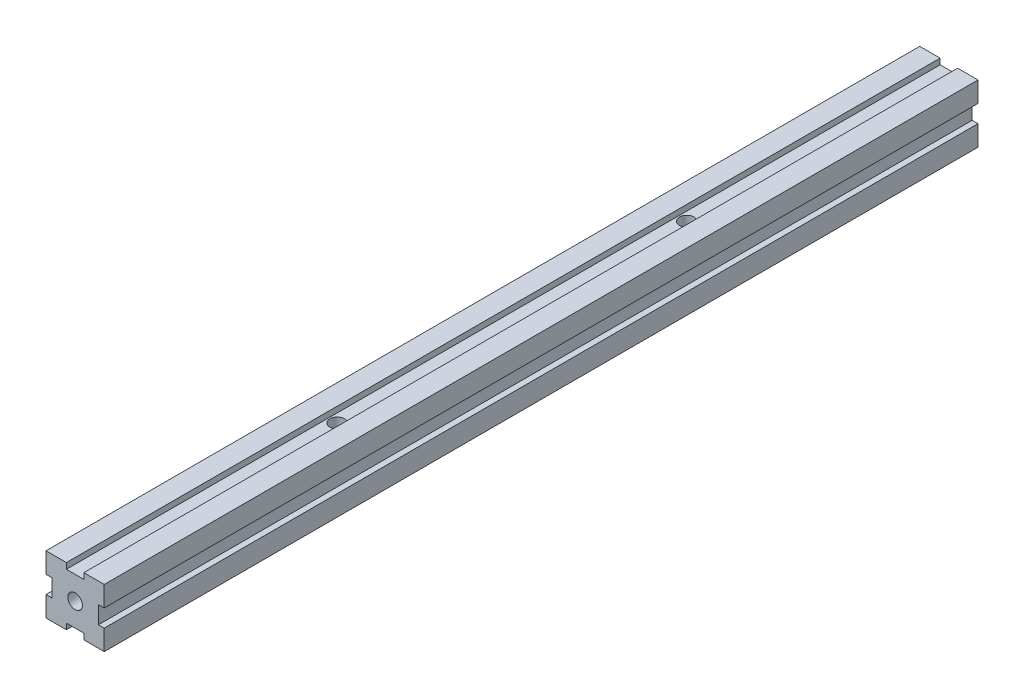
ISO-10303-21;
HEADER;
FILE_DESCRIPTION(('STEP AP214'),'2;1');
FILE_NAME('part.step','',(''),(''),'','','');
FILE_SCHEMA(('AUTOMOTIVE_DESIGN { 1 0 10303 214 1 1 1 1 }'));
ENDSEC;
DATA;
#1=APPLICATION_CONTEXT('core data for automotive mechanical design processes');
#2=APPLICATION_PROTOCOL_DEFINITION('international standard','automotive_design',2000,#1);
#3=PRODUCT_CONTEXT('',#1,'mechanical');
#4=PRODUCT('Part','Part','',(#3));
#5=PRODUCT_RELATED_PRODUCT_CATEGORY('part','',(#4));
#6=PRODUCT_DEFINITION_FORMATION('','',#4);
#7=PRODUCT_DEFINITION_CONTEXT('part definition',#1,'design');
#8=PRODUCT_DEFINITION('design','',#6,#7);
#9=PRODUCT_DEFINITION_SHAPE('','',#8);
#10=(LENGTH_UNIT() NAMED_UNIT(*) SI_UNIT(.MILLI.,.METRE.));
#11=(NAMED_UNIT(*) PLANE_ANGLE_UNIT() SI_UNIT($,.RADIAN.));
#12=(NAMED_UNIT(*) SI_UNIT($,.STERADIAN.) SOLID_ANGLE_UNIT());
#13=UNCERTAINTY_MEASURE_WITH_UNIT(LENGTH_MEASURE(1.E-05),#10,'distance_accuracy_value','');
#14=(GEOMETRIC_REPRESENTATION_CONTEXT(3) GLOBAL_UNCERTAINTY_ASSIGNED_CONTEXT((#13)) GLOBAL_UNIT_ASSIGNED_CONTEXT((#10,
#11,#12)) REPRESENTATION_CONTEXT('',''));
#15=CARTESIAN_POINT('',(0.,0.,0.));
#16=DIRECTION('',(0.,0.,1.));
#17=DIRECTION('',(1.,0.,0.));
#18=AXIS2_PLACEMENT_3D('',#15,#16,#17);
#19=CARTESIAN_POINT('',(10.,-10.,300.));
#20=DIRECTION('',(0.,0.,-1.));
#21=DIRECTION('',(-1.,0.,0.));
#22=AXIS2_PLACEMENT_3D('',#19,#20,#21);
#23=CYLINDRICAL_SURFACE('',#22,2.5);
#24=CARTESIAN_POINT('',(10.,-10.,210.));
#25=DIRECTION('',(0.,0.707106781186547,-0.707106781186547));
#26=DIRECTION('',(0.,-0.707106781186547,-0.707106781186547));
#27=AXIS2_PLACEMENT_3D('',#24,#25,#26);
#28=ELLIPSE('',#27,3.53553390593274,2.5);
#29=CARTESIAN_POINT('',(12.5,-10.,210.));
#30=VERTEX_POINT('',#29);
#31=CARTESIAN_POINT('',(7.5,-10.,210.));
#32=VERTEX_POINT('',#31);
#33=EDGE_CURVE('E189',#30,#32,#28,.F.);
#34=ORIENTED_EDGE('',*,*,#33,.F.);
#35=CARTESIAN_POINT('',(10.,-10.,210.));
#36=DIRECTION('',(0.,-0.707106781186547,-0.707106781186547));
#37=DIRECTION('',(0.,0.707106781186547,-0.707106781186547));
#38=AXIS2_PLACEMENT_3D('',#35,#36,#37);
#39=ELLIPSE('',#38,3.53553390593274,2.5);
#40=EDGE_CURVE('E56',#32,#30,#39,.F.);
#41=ORIENTED_EDGE('',*,*,#40,.F.);
#42=EDGE_LOOP('',(#34,#41));
#43=FACE_BOUND('',#42,.T.);
#44=CARTESIAN_POINT('',(10.,-10.,300.));
#45=DIRECTION('',(0.,0.,1.));
#46=DIRECTION('',(1.,0.,0.));
#47=AXIS2_PLACEMENT_3D('',#44,#45,#46);
#48=CIRCLE('',#47,2.5);
#49=CARTESIAN_POINT('',(12.5,-10.,300.));
#50=VERTEX_POINT('',#49);
#51=EDGE_CURVE('E224',#50,#50,#48,.T.);
#52=ORIENTED_EDGE('',*,*,#51,.T.);
#53=EDGE_LOOP('',(#52));
#54=FACE_BOUND('',#53,.T.);
#55=ADVANCED_FACE('F35',(#43,#54),#23,.F.);
#56=CARTESIAN_POINT('',(0.,0.,300.));
#57=DIRECTION('',(0.,0.,1.));
#58=DIRECTION('',(1.,0.,0.));
#59=AXIS2_PLACEMENT_3D('',#56,#57,#58);
#60=PLANE('',#59);
#61=DIRECTION('',(0.,-1.,0.));
#62=VECTOR('',#61,1.);
#63=CARTESIAN_POINT('',(0.,0.,300.));
#64=LINE('',#63,#62);
#65=CARTESIAN_POINT('',(0.,0.,300.));
#66=VERTEX_POINT('',#65);
#67=CARTESIAN_POINT('',(0.,-7.,300.));
#68=VERTEX_POINT('',#67);
#69=EDGE_CURVE('E234',#66,#68,#64,.T.);
#70=ORIENTED_EDGE('',*,*,#69,.T.);
#71=DIRECTION('',(1.,0.,0.));
#72=VECTOR('',#71,1.);
#73=CARTESIAN_POINT('',(0.,-7.,300.));
#74=LINE('',#73,#72);
#75=CARTESIAN_POINT('',(2.,-7.,300.));
#76=VERTEX_POINT('',#75);
#77=EDGE_CURVE('E237',#68,#76,#74,.T.);
#78=ORIENTED_EDGE('',*,*,#77,.T.);
#79=DIRECTION('',(0.,-1.,0.));
#80=VECTOR('',#79,1.);
#81=CARTESIAN_POINT('',(2.,-7.,300.));
#82=LINE('',#81,#80);
#83=CARTESIAN_POINT('',(2.,-13.,300.));
#84=VERTEX_POINT('',#83);
#85=EDGE_CURVE('E240',#76,#84,#82,.T.);
#86=ORIENTED_EDGE('',*,*,#85,.T.);
#87=DIRECTION('',(-1.,0.,0.));
#88=VECTOR('',#87,1.);
#89=CARTESIAN_POINT('',(0.,-13.,300.));
#90=LINE('',#89,#88);
#91=CARTESIAN_POINT('',(0.,-13.,300.));
#92=VERTEX_POINT('',#91);
#93=EDGE_CURVE('E242',#84,#92,#90,.T.);
#94=ORIENTED_EDGE('',*,*,#93,.T.);
#95=DIRECTION('',(0.,-1.,0.));
#96=VECTOR('',#95,1.);
#97=CARTESIAN_POINT('',(0.,-13.,300.));
#98=LINE('',#97,#96);
#99=CARTESIAN_POINT('',(0.,-20.,300.));
#100=VERTEX_POINT('',#99);
#101=EDGE_CURVE('E244',#92,#100,#98,.T.);
#102=ORIENTED_EDGE('',*,*,#101,.T.);
#103=DIRECTION('',(1.,0.,0.));
#104=VECTOR('',#103,1.);
#105=CARTESIAN_POINT('',(0.,-20.,300.));
#106=LINE('',#105,#104);
#107=CARTESIAN_POINT('',(7.,-20.,300.));
#108=VERTEX_POINT('',#107);
#109=EDGE_CURVE('E246',#100,#108,#106,.T.);
#110=ORIENTED_EDGE('',*,*,#109,.T.);
#111=DIRECTION('',(0.,1.,0.));
#112=VECTOR('',#111,1.);
#113=CARTESIAN_POINT('',(7.,-20.,300.));
#114=LINE('',#113,#112);
#115=CARTESIAN_POINT('',(7.,-18.,300.));
#116=VERTEX_POINT('',#115);
#117=EDGE_CURVE('E248',#108,#116,#114,.T.);
#118=ORIENTED_EDGE('',*,*,#117,.T.);
#119=DIRECTION('',(1.,0.,0.));
#120=VECTOR('',#119,1.);
#121=CARTESIAN_POINT('',(7.,-18.,300.));
#122=LINE('',#121,#120);
#123=CARTESIAN_POINT('',(13.,-18.,300.));
#124=VERTEX_POINT('',#123);
#125=EDGE_CURVE('E250',#116,#124,#122,.T.);
#126=ORIENTED_EDGE('',*,*,#125,.T.);
#127=DIRECTION('',(0.,-1.,0.));
#128=VECTOR('',#127,1.);
#129=CARTESIAN_POINT('',(13.,-20.,300.));
#130=LINE('',#129,#128);
#131=CARTESIAN_POINT('',(13.,-20.,300.));
#132=VERTEX_POINT('',#131);
#133=EDGE_CURVE('E252',#124,#132,#130,.T.);
#134=ORIENTED_EDGE('',*,*,#133,.T.);
#135=DIRECTION('',(1.,0.,0.));
#136=VECTOR('',#135,1.);
#137=CARTESIAN_POINT('',(13.,-20.,300.));
#138=LINE('',#137,#136);
#139=CARTESIAN_POINT('',(20.,-20.,300.));
#140=VERTEX_POINT('',#139);
#141=EDGE_CURVE('E254',#132,#140,#138,.T.);
#142=ORIENTED_EDGE('',*,*,#141,.T.);
#143=DIRECTION('',(0.,1.,0.));
#144=VECTOR('',#143,1.);
#145=CARTESIAN_POINT('',(20.,-13.,300.));
#146=LINE('',#145,#144);
#147=CARTESIAN_POINT('',(20.,-13.,300.));
#148=VERTEX_POINT('',#147);
#149=EDGE_CURVE('E256',#140,#148,#146,.T.);
#150=ORIENTED_EDGE('',*,*,#149,.T.);
#151=DIRECTION('',(-1.,0.,0.));
#152=VECTOR('',#151,1.);
#153=CARTESIAN_POINT('',(20.,-13.,300.));
#154=LINE('',#153,#152);
#155=CARTESIAN_POINT('',(18.,-13.,300.));
#156=VERTEX_POINT('',#155);
#157=EDGE_CURVE('E258',#148,#156,#154,.T.);
#158=ORIENTED_EDGE('',*,*,#157,.T.);
#159=DIRECTION('',(0.,1.,0.));
#160=VECTOR('',#159,1.);
#161=CARTESIAN_POINT('',(18.,-7.,300.));
#162=LINE('',#161,#160);
#163=CARTESIAN_POINT('',(18.,-7.,300.));
#164=VERTEX_POINT('',#163);
#165=EDGE_CURVE('E260',#156,#164,#162,.T.);
#166=ORIENTED_EDGE('',*,*,#165,.T.);
#167=DIRECTION('',(1.,0.,0.));
#168=VECTOR('',#167,1.);
#169=CARTESIAN_POINT('',(20.,-7.,300.));
#170=LINE('',#169,#168);
#171=CARTESIAN_POINT('',(20.,-7.,300.));
#172=VERTEX_POINT('',#171);
#173=EDGE_CURVE('E262',#164,#172,#170,.T.);
#174=ORIENTED_EDGE('',*,*,#173,.T.);
#175=DIRECTION('',(0.,1.,0.));
#176=VECTOR('',#175,1.);
#177=CARTESIAN_POINT('',(20.,0.,300.));
#178=LINE('',#177,#176);
#179=CARTESIAN_POINT('',(20.,0.,300.));
#180=VERTEX_POINT('',#179);
#181=EDGE_CURVE('E264',#172,#180,#178,.T.);
#182=ORIENTED_EDGE('',*,*,#181,.T.);
#183=DIRECTION('',(-1.,0.,0.));
#184=VECTOR('',#183,1.);
#185=CARTESIAN_POINT('',(13.,0.,300.));
#186=LINE('',#185,#184);
#187=CARTESIAN_POINT('',(13.,0.,300.));
#188=VERTEX_POINT('',#187);
#189=EDGE_CURVE('E266',#180,#188,#186,.T.);
#190=ORIENTED_EDGE('',*,*,#189,.T.);
#191=DIRECTION('',(0.,-1.,0.));
#192=VECTOR('',#191,1.);
#193=CARTESIAN_POINT('',(13.,0.,300.));
#194=LINE('',#193,#192);
#195=CARTESIAN_POINT('',(13.,-2.,300.));
#196=VERTEX_POINT('',#195);
#197=EDGE_CURVE('E268',#188,#196,#194,.T.);
#198=ORIENTED_EDGE('',*,*,#197,.T.);
#199=DIRECTION('',(-1.,0.,0.));
#200=VECTOR('',#199,1.);
#201=CARTESIAN_POINT('',(7.,-2.,300.));
#202=LINE('',#201,#200);
#203=CARTESIAN_POINT('',(7.,-2.,300.));
#204=VERTEX_POINT('',#203);
#205=EDGE_CURVE('E270',#196,#204,#202,.T.);
#206=ORIENTED_EDGE('',*,*,#205,.T.);
#207=DIRECTION('',(0.,1.,0.));
#208=VECTOR('',#207,1.);
#209=CARTESIAN_POINT('',(7.,0.,300.));
#210=LINE('',#209,#208);
#211=CARTESIAN_POINT('',(7.,0.,300.));
#212=VERTEX_POINT('',#211);
#213=EDGE_CURVE('E272',#204,#212,#210,.T.);
#214=ORIENTED_EDGE('',*,*,#213,.T.);
#215=DIRECTION('',(-1.,0.,0.));
#216=VECTOR('',#215,1.);
#217=CARTESIAN_POINT('',(0.,0.,300.));
#218=LINE('',#217,#216);
#219=EDGE_CURVE('E274',#212,#66,#218,.T.);
#220=ORIENTED_EDGE('',*,*,#219,.T.);
#221=EDGE_LOOP('',(#70,#78,#86,#94,#102,#110,#118,#126,#134,#142,#150,#158,#166,#174,#182,#190,
#198,#206,#214,#220));
#222=FACE_BOUND('',#221,.T.);
#223=ORIENTED_EDGE('',*,*,#51,.F.);
#224=EDGE_LOOP('',(#223));
#225=FACE_BOUND('',#224,.T.);
#226=ADVANCED_FACE('F398',(#222,#225),#60,.T.);
#227=CARTESIAN_POINT('',(0.,0.,0.));
#228=DIRECTION('',(0.,0.,1.));
#229=DIRECTION('',(1.,0.,0.));
#230=AXIS2_PLACEMENT_3D('',#227,#228,#229);
#231=PLANE('',#230);
#232=DIRECTION('',(0.,-1.,0.));
#233=VECTOR('',#232,1.);
#234=CARTESIAN_POINT('',(0.,0.,0.));
#235=LINE('',#234,#233);
#236=CARTESIAN_POINT('',(0.,0.,0.));
#237=VERTEX_POINT('',#236);
#238=CARTESIAN_POINT('',(0.,-7.,0.));
#239=VERTEX_POINT('',#238);
#240=EDGE_CURVE('E228',#237,#239,#235,.T.);
#241=ORIENTED_EDGE('',*,*,#240,.F.);
#242=DIRECTION('',(-1.,0.,0.));
#243=VECTOR('',#242,1.);
#244=CARTESIAN_POINT('',(0.,0.,0.));
#245=LINE('',#244,#243);
#246=CARTESIAN_POINT('',(7.,0.,0.));
#247=VERTEX_POINT('',#246);
#248=EDGE_CURVE('E238',#247,#237,#245,.T.);
#249=ORIENTED_EDGE('',*,*,#248,.F.);
#250=DIRECTION('',(0.,1.,0.));
#251=VECTOR('',#250,1.);
#252=CARTESIAN_POINT('',(7.,0.,0.));
#253=LINE('',#252,#251);
#254=CARTESIAN_POINT('',(7.,-2.,0.));
#255=VERTEX_POINT('',#254);
#256=EDGE_CURVE('E313',#255,#247,#253,.T.);
#257=ORIENTED_EDGE('',*,*,#256,.F.);
#258=DIRECTION('',(-1.,0.,0.));
#259=VECTOR('',#258,1.);
#260=CARTESIAN_POINT('',(7.,-2.,0.));
#261=LINE('',#260,#259);
#262=CARTESIAN_POINT('',(13.,-2.,0.));
#263=VERTEX_POINT('',#262);
#264=EDGE_CURVE('E311',#263,#255,#261,.T.);
#265=ORIENTED_EDGE('',*,*,#264,.F.);
#266=DIRECTION('',(0.,-1.,0.));
#267=VECTOR('',#266,1.);
#268=CARTESIAN_POINT('',(13.,0.,0.));
#269=LINE('',#268,#267);
#270=CARTESIAN_POINT('',(13.,0.,0.));
#271=VERTEX_POINT('',#270);
#272=EDGE_CURVE('E309',#271,#263,#269,.T.);
#273=ORIENTED_EDGE('',*,*,#272,.F.);
#274=DIRECTION('',(-1.,0.,0.));
#275=VECTOR('',#274,1.);
#276=CARTESIAN_POINT('',(13.,0.,0.));
#277=LINE('',#276,#275);
#278=CARTESIAN_POINT('',(20.,0.,0.));
#279=VERTEX_POINT('',#278);
#280=EDGE_CURVE('E307',#279,#271,#277,.T.);
#281=ORIENTED_EDGE('',*,*,#280,.F.);
#282=DIRECTION('',(0.,1.,0.));
#283=VECTOR('',#282,1.);
#284=CARTESIAN_POINT('',(20.,0.,0.));
#285=LINE('',#284,#283);
#286=CARTESIAN_POINT('',(20.,-7.,0.));
#287=VERTEX_POINT('',#286);
#288=EDGE_CURVE('E305',#287,#279,#285,.T.);
#289=ORIENTED_EDGE('',*,*,#288,.F.);
#290=DIRECTION('',(1.,0.,0.));
#291=VECTOR('',#290,1.);
#292=CARTESIAN_POINT('',(20.,-7.,0.));
#293=LINE('',#292,#291);
#294=CARTESIAN_POINT('',(18.,-7.,0.));
#295=VERTEX_POINT('',#294);
#296=EDGE_CURVE('E303',#295,#287,#293,.T.);
#297=ORIENTED_EDGE('',*,*,#296,.F.);
#298=DIRECTION('',(0.,1.,0.));
#299=VECTOR('',#298,1.);
#300=CARTESIAN_POINT('',(18.,-7.,0.));
#301=LINE('',#300,#299);
#302=CARTESIAN_POINT('',(18.,-13.,0.));
#303=VERTEX_POINT('',#302);
#304=EDGE_CURVE('E301',#303,#295,#301,.T.);
#305=ORIENTED_EDGE('',*,*,#304,.F.);
#306=DIRECTION('',(-1.,0.,0.));
#307=VECTOR('',#306,1.);
#308=CARTESIAN_POINT('',(20.,-13.,0.));
#309=LINE('',#308,#307);
#310=CARTESIAN_POINT('',(20.,-13.,0.));
#311=VERTEX_POINT('',#310);
#312=EDGE_CURVE('E299',#311,#303,#309,.T.);
#313=ORIENTED_EDGE('',*,*,#312,.F.);
#314=DIRECTION('',(0.,1.,0.));
#315=VECTOR('',#314,1.);
#316=CARTESIAN_POINT('',(20.,-13.,0.));
#317=LINE('',#316,#315);
#318=CARTESIAN_POINT('',(20.,-20.,0.));
#319=VERTEX_POINT('',#318);
#320=EDGE_CURVE('E297',#319,#311,#317,.T.);
#321=ORIENTED_EDGE('',*,*,#320,.F.);
#322=DIRECTION('',(1.,0.,0.));
#323=VECTOR('',#322,1.);
#324=CARTESIAN_POINT('',(13.,-20.,0.));
#325=LINE('',#324,#323);
#326=CARTESIAN_POINT('',(13.,-20.,0.));
#327=VERTEX_POINT('',#326);
#328=EDGE_CURVE('E295',#327,#319,#325,.T.);
#329=ORIENTED_EDGE('',*,*,#328,.F.);
#330=DIRECTION('',(0.,-1.,0.));
#331=VECTOR('',#330,1.);
#332=CARTESIAN_POINT('',(13.,-20.,0.));
#333=LINE('',#332,#331);
#334=CARTESIAN_POINT('',(13.,-18.,0.));
#335=VERTEX_POINT('',#334);
#336=EDGE_CURVE('E293',#335,#327,#333,.T.);
#337=ORIENTED_EDGE('',*,*,#336,.F.);
#338=DIRECTION('',(1.,0.,0.));
#339=VECTOR('',#338,1.);
#340=CARTESIAN_POINT('',(7.,-18.,0.));
#341=LINE('',#340,#339);
#342=CARTESIAN_POINT('',(7.,-18.,0.));
#343=VERTEX_POINT('',#342);
#344=EDGE_CURVE('E291',#343,#335,#341,.T.);
#345=ORIENTED_EDGE('',*,*,#344,.F.);
#346=DIRECTION('',(0.,1.,0.));
#347=VECTOR('',#346,1.);
#348=CARTESIAN_POINT('',(7.,-20.,0.));
#349=LINE('',#348,#347);
#350=CARTESIAN_POINT('',(7.,-20.,0.));
#351=VERTEX_POINT('',#350);
#352=EDGE_CURVE('E289',#351,#343,#349,.T.);
#353=ORIENTED_EDGE('',*,*,#352,.F.);
#354=DIRECTION('',(1.,0.,0.));
#355=VECTOR('',#354,1.);
#356=CARTESIAN_POINT('',(0.,-20.,0.));
#357=LINE('',#356,#355);
#358=CARTESIAN_POINT('',(0.,-20.,0.));
#359=VERTEX_POINT('',#358);
#360=EDGE_CURVE('E287',#359,#351,#357,.T.);
#361=ORIENTED_EDGE('',*,*,#360,.F.);
#362=DIRECTION('',(0.,-1.,0.));
#363=VECTOR('',#362,1.);
#364=CARTESIAN_POINT('',(0.,-13.,0.));
#365=LINE('',#364,#363);
#366=CARTESIAN_POINT('',(0.,-13.,0.));
#367=VERTEX_POINT('',#366);
#368=EDGE_CURVE('E285',#367,#359,#365,.T.);
#369=ORIENTED_EDGE('',*,*,#368,.F.);
#370=DIRECTION('',(-1.,0.,0.));
#371=VECTOR('',#370,1.);
#372=CARTESIAN_POINT('',(0.,-13.,0.));
#373=LINE('',#372,#371);
#374=CARTESIAN_POINT('',(2.,-13.,0.));
#375=VERTEX_POINT('',#374);
#376=EDGE_CURVE('E283',#375,#367,#373,.T.);
#377=ORIENTED_EDGE('',*,*,#376,.F.);
#378=DIRECTION('',(0.,-1.,0.));
#379=VECTOR('',#378,1.);
#380=CARTESIAN_POINT('',(2.,-7.,0.));
#381=LINE('',#380,#379);
#382=CARTESIAN_POINT('',(2.,-7.,0.));
#383=VERTEX_POINT('',#382);
#384=EDGE_CURVE('E281',#383,#375,#381,.T.);
#385=ORIENTED_EDGE('',*,*,#384,.F.);
#386=DIRECTION('',(1.,0.,0.));
#387=VECTOR('',#386,1.);
#388=CARTESIAN_POINT('',(0.,-7.,0.));
#389=LINE('',#388,#387);
#390=EDGE_CURVE('E279',#239,#383,#389,.T.);
#391=ORIENTED_EDGE('',*,*,#390,.F.);
#392=EDGE_LOOP('',(#241,#249,#257,#265,#273,#281,#289,#297,#305,#313,#321,#329,#337,#345,#353,
#361,#369,#377,#385,#391));
#393=FACE_BOUND('',#392,.T.);
#394=CARTESIAN_POINT('',(10.,-10.,0.));
#395=DIRECTION('',(0.,0.,1.));
#396=DIRECTION('',(1.,0.,0.));
#397=AXIS2_PLACEMENT_3D('',#394,#395,#396);
#398=CIRCLE('',#397,2.5);
#399=CARTESIAN_POINT('',(12.5,-10.,0.));
#400=VERTEX_POINT('',#399);
#401=EDGE_CURVE('E222',#400,#400,#398,.T.);
#402=ORIENTED_EDGE('',*,*,#401,.T.);
#403=EDGE_LOOP('',(#402));
#404=FACE_BOUND('',#403,.T.);
#405=ADVANCED_FACE('F383',(#393,#404),#231,.F.);
#406=CARTESIAN_POINT('',(0.,0.,300.));
#407=DIRECTION('',(1.,0.,0.));
#408=DIRECTION('',(0.,1.,0.));
#409=AXIS2_PLACEMENT_3D('',#406,#407,#408);
#410=PLANE('',#409);
#411=ORIENTED_EDGE('',*,*,#240,.T.);
#412=DIRECTION('',(0.,0.,-1.));
#413=VECTOR('',#412,1.);
#414=CARTESIAN_POINT('',(0.,-7.,300.));
#415=LINE('',#414,#413);
#416=EDGE_CURVE('E197',#68,#239,#415,.T.);
#417=ORIENTED_EDGE('',*,*,#416,.F.);
#418=ORIENTED_EDGE('',*,*,#69,.F.);
#419=DIRECTION('',(0.,0.,-1.));
#420=VECTOR('',#419,1.);
#421=CARTESIAN_POINT('',(0.,0.,300.));
#422=LINE('',#421,#420);
#423=EDGE_CURVE('E276',#66,#237,#422,.T.);
#424=ORIENTED_EDGE('',*,*,#423,.T.);
#425=EDGE_LOOP('',(#411,#417,#418,#424));
#426=FACE_BOUND('',#425,.T.);
#427=ADVANCED_FACE('F37',(#426),#410,.F.);
#428=CARTESIAN_POINT('',(0.,-7.,300.));
#429=DIRECTION('',(0.,1.,0.));
#430=DIRECTION('',(-1.,0.,0.));
#431=AXIS2_PLACEMENT_3D('',#428,#429,#430);
#432=PLANE('',#431);
#433=ORIENTED_EDGE('',*,*,#390,.T.);
#434=DIRECTION('',(0.,0.,-1.));
#435=VECTOR('',#434,1.);
#436=CARTESIAN_POINT('',(2.,-7.,300.));
#437=LINE('',#436,#435);
#438=EDGE_CURVE('E369',#76,#383,#437,.T.);
#439=ORIENTED_EDGE('',*,*,#438,.F.);
#440=ORIENTED_EDGE('',*,*,#77,.F.);
#441=ORIENTED_EDGE('',*,*,#416,.T.);
#442=EDGE_LOOP('',(#433,#439,#440,#441));
#443=FACE_BOUND('',#442,.T.);
#444=ADVANCED_FACE('F375',(#443),#432,.F.);
#445=CARTESIAN_POINT('',(2.,-7.,300.));
#446=DIRECTION('',(1.,0.,0.));
#447=DIRECTION('',(0.,0.,-1.));
#448=AXIS2_PLACEMENT_3D('',#445,#446,#447);
#449=PLANE('',#448);
#450=ORIENTED_EDGE('',*,*,#384,.T.);
#451=DIRECTION('',(0.,0.,-1.));
#452=VECTOR('',#451,1.);
#453=CARTESIAN_POINT('',(2.,-13.,300.));
#454=LINE('',#453,#452);
#455=EDGE_CURVE('E366',#84,#375,#454,.T.);
#456=ORIENTED_EDGE('',*,*,#455,.F.);
#457=ORIENTED_EDGE('',*,*,#85,.F.);
#458=ORIENTED_EDGE('',*,*,#438,.T.);
#459=EDGE_LOOP('',(#450,#456,#457,#458));
#460=FACE_BOUND('',#459,.T.);
#461=ADVANCED_FACE('F390',(#460),#449,.F.);
#462=CARTESIAN_POINT('',(0.,-13.,300.));
#463=DIRECTION('',(0.,-1.,0.));
#464=DIRECTION('',(1.,0.,0.));
#465=AXIS2_PLACEMENT_3D('',#462,#463,#464);
#466=PLANE('',#465);
#467=ORIENTED_EDGE('',*,*,#376,.T.);
#468=DIRECTION('',(0.,0.,-1.));
#469=VECTOR('',#468,1.);
#470=CARTESIAN_POINT('',(0.,-13.,300.));
#471=LINE('',#470,#469);
#472=EDGE_CURVE('E363',#92,#367,#471,.T.);
#473=ORIENTED_EDGE('',*,*,#472,.F.);
#474=ORIENTED_EDGE('',*,*,#93,.F.);
#475=ORIENTED_EDGE('',*,*,#455,.T.);
#476=EDGE_LOOP('',(#467,#473,#474,#475));
#477=FACE_BOUND('',#476,.T.);
#478=ADVANCED_FACE('F394',(#477),#466,.F.);
#479=CARTESIAN_POINT('',(0.,-13.,300.));
#480=DIRECTION('',(1.,0.,0.));
#481=DIRECTION('',(0.,1.,0.));
#482=AXIS2_PLACEMENT_3D('',#479,#480,#481);
#483=PLANE('',#482);
#484=ORIENTED_EDGE('',*,*,#368,.T.);
#485=DIRECTION('',(0.,0.,-1.));
#486=VECTOR('',#485,1.);
#487=CARTESIAN_POINT('',(0.,-20.,300.));
#488=LINE('',#487,#486);
#489=EDGE_CURVE('E360',#100,#359,#488,.T.);
#490=ORIENTED_EDGE('',*,*,#489,.F.);
#491=ORIENTED_EDGE('',*,*,#101,.F.);
#492=ORIENTED_EDGE('',*,*,#472,.T.);
#493=EDGE_LOOP('',(#484,#490,#491,#492));
#494=FACE_BOUND('',#493,.T.);
#495=ADVANCED_FACE('F473',(#494),#483,.F.);
#496=CARTESIAN_POINT('',(0.,-20.,300.));
#497=DIRECTION('',(0.,1.,0.));
#498=DIRECTION('',(0.,0.,1.));
#499=AXIS2_PLACEMENT_3D('',#496,#497,#498);
#500=PLANE('',#499);
#501=ORIENTED_EDGE('',*,*,#360,.T.);
#502=DIRECTION('',(0.,0.,-1.));
#503=VECTOR('',#502,1.);
#504=CARTESIAN_POINT('',(7.,-20.,300.));
#505=LINE('',#504,#503);
#506=EDGE_CURVE('E357',#108,#351,#505,.T.);
#507=ORIENTED_EDGE('',*,*,#506,.F.);
#508=ORIENTED_EDGE('',*,*,#109,.F.);
#509=ORIENTED_EDGE('',*,*,#489,.T.);
#510=EDGE_LOOP('',(#501,#507,#508,#509));
#511=FACE_BOUND('',#510,.T.);
#512=ADVANCED_FACE('F470',(#511),#500,.F.);
#513=CARTESIAN_POINT('',(7.,-20.,300.));
#514=DIRECTION('',(-1.,0.,0.));
#515=DIRECTION('',(0.,-1.,0.));
#516=AXIS2_PLACEMENT_3D('',#513,#514,#515);
#517=PLANE('',#516);
#518=ORIENTED_EDGE('',*,*,#352,.T.);
#519=DIRECTION('',(0.,0.,-1.));
#520=VECTOR('',#519,1.);
#521=CARTESIAN_POINT('',(7.,-18.,300.));
#522=LINE('',#521,#520);
#523=EDGE_CURVE('E354',#116,#343,#522,.T.);
#524=ORIENTED_EDGE('',*,*,#523,.F.);
#525=ORIENTED_EDGE('',*,*,#117,.F.);
#526=ORIENTED_EDGE('',*,*,#506,.T.);
#527=EDGE_LOOP('',(#518,#524,#525,#526));
#528=FACE_BOUND('',#527,.T.);
#529=ADVANCED_FACE('F466',(#528),#517,.F.);
#530=CARTESIAN_POINT('',(7.,-18.,300.));
#531=DIRECTION('',(0.,1.,0.));
#532=DIRECTION('',(0.,0.,1.));
#533=AXIS2_PLACEMENT_3D('',#530,#531,#532);
#534=PLANE('',#533);
#535=CARTESIAN_POINT('',(10.,-18.,90.));
#536=DIRECTION('',(0.,1.,0.));
#537=DIRECTION('',(0.,0.,1.));
#538=AXIS2_PLACEMENT_3D('',#535,#536,#537);
#539=CIRCLE('',#538,2.5);
#540=CARTESIAN_POINT('',(10.,-18.,92.5));
#541=VERTEX_POINT('',#540);
#542=EDGE_CURVE('E225',#541,#541,#539,.T.);
#543=ORIENTED_EDGE('',*,*,#542,.T.);
#544=EDGE_LOOP('',(#543));
#545=FACE_BOUND('',#544,.T.);
#546=CARTESIAN_POINT('',(10.,-18.,210.));
#547=DIRECTION('',(0.,1.,0.));
#548=DIRECTION('',(0.,0.,1.));
#549=AXIS2_PLACEMENT_3D('',#546,#547,#548);
#550=CIRCLE('',#549,2.5);
#551=CARTESIAN_POINT('',(10.,-18.,212.5));
#552=VERTEX_POINT('',#551);
#553=EDGE_CURVE('E704',#552,#552,#550,.T.);
#554=ORIENTED_EDGE('',*,*,#553,.T.);
#555=EDGE_LOOP('',(#554));
#556=FACE_BOUND('',#555,.T.);
#557=ORIENTED_EDGE('',*,*,#344,.T.);
#558=DIRECTION('',(0.,0.,-1.));
#559=VECTOR('',#558,1.);
#560=CARTESIAN_POINT('',(13.,-18.,300.));
#561=LINE('',#560,#559);
#562=EDGE_CURVE('E351',#124,#335,#561,.T.);
#563=ORIENTED_EDGE('',*,*,#562,.F.);
#564=ORIENTED_EDGE('',*,*,#125,.F.);
#565=ORIENTED_EDGE('',*,*,#523,.T.);
#566=EDGE_LOOP('',(#557,#563,#564,#565));
#567=FACE_BOUND('',#566,.T.);
#568=ADVANCED_FACE('F462',(#545,#556,#567),#534,.F.);
#569=CARTESIAN_POINT('',(13.,-20.,300.));
#570=DIRECTION('',(1.,0.,0.));
#571=DIRECTION('',(0.,1.,0.));
#572=AXIS2_PLACEMENT_3D('',#569,#570,#571);
#573=PLANE('',#572);
#574=ORIENTED_EDGE('',*,*,#336,.T.);
#575=DIRECTION('',(0.,0.,-1.));
#576=VECTOR('',#575,1.);
#577=CARTESIAN_POINT('',(13.,-20.,300.));
#578=LINE('',#577,#576);
#579=EDGE_CURVE('E348',#132,#327,#578,.T.);
#580=ORIENTED_EDGE('',*,*,#579,.F.);
#581=ORIENTED_EDGE('',*,*,#133,.F.);
#582=ORIENTED_EDGE('',*,*,#562,.T.);
#583=EDGE_LOOP('',(#574,#580,#581,#582));
#584=FACE_BOUND('',#583,.T.);
#585=ADVANCED_FACE('F457',(#584),#573,.F.);
#586=CARTESIAN_POINT('',(13.,-20.,300.));
#587=DIRECTION('',(0.,1.,0.));
#588=DIRECTION('',(0.,0.,1.));
#589=AXIS2_PLACEMENT_3D('',#586,#587,#588);
#590=PLANE('',#589);
#591=ORIENTED_EDGE('',*,*,#328,.T.);
#592=DIRECTION('',(0.,0.,-1.));
#593=VECTOR('',#592,1.);
#594=CARTESIAN_POINT('',(20.,-20.,300.));
#595=LINE('',#594,#593);
#596=EDGE_CURVE('E345',#140,#319,#595,.T.);
#597=ORIENTED_EDGE('',*,*,#596,.F.);
#598=ORIENTED_EDGE('',*,*,#141,.F.);
#599=ORIENTED_EDGE('',*,*,#579,.T.);
#600=EDGE_LOOP('',(#591,#597,#598,#599));
#601=FACE_BOUND('',#600,.T.);
#602=ADVANCED_FACE('F451',(#601),#590,.F.);
#603=CARTESIAN_POINT('',(20.,-13.,300.));
#604=DIRECTION('',(-1.,0.,0.));
#605=DIRECTION('',(0.,0.,1.));
#606=AXIS2_PLACEMENT_3D('',#603,#604,#605);
#607=PLANE('',#606);
#608=ORIENTED_EDGE('',*,*,#320,.T.);
#609=DIRECTION('',(0.,0.,-1.));
#610=VECTOR('',#609,1.);
#611=CARTESIAN_POINT('',(20.,-13.,300.));
#612=LINE('',#611,#610);
#613=EDGE_CURVE('E342',#148,#311,#612,.T.);
#614=ORIENTED_EDGE('',*,*,#613,.F.);
#615=ORIENTED_EDGE('',*,*,#149,.F.);
#616=ORIENTED_EDGE('',*,*,#596,.T.);
#617=EDGE_LOOP('',(#608,#614,#615,#616));
#618=FACE_BOUND('',#617,.T.);
#619=ADVANCED_FACE('F447',(#618),#607,.F.);
#620=CARTESIAN_POINT('',(20.,-13.,300.));
#621=DIRECTION('',(0.,-1.,0.));
#622=DIRECTION('',(1.,0.,0.));
#623=AXIS2_PLACEMENT_3D('',#620,#621,#622);
#624=PLANE('',#623);
#625=ORIENTED_EDGE('',*,*,#312,.T.);
#626=DIRECTION('',(0.,0.,-1.));
#627=VECTOR('',#626,1.);
#628=CARTESIAN_POINT('',(18.,-13.,300.));
#629=LINE('',#628,#627);
#630=EDGE_CURVE('E339',#156,#303,#629,.T.);
#631=ORIENTED_EDGE('',*,*,#630,.F.);
#632=ORIENTED_EDGE('',*,*,#157,.F.);
#633=ORIENTED_EDGE('',*,*,#613,.T.);
#634=EDGE_LOOP('',(#625,#631,#632,#633));
#635=FACE_BOUND('',#634,.T.);
#636=ADVANCED_FACE('F442',(#635),#624,.F.);
#637=CARTESIAN_POINT('',(18.,-7.,300.));
#638=DIRECTION('',(-1.,0.,0.));
#639=DIRECTION('',(0.,0.,1.));
#640=AXIS2_PLACEMENT_3D('',#637,#638,#639);
#641=PLANE('',#640);
#642=ORIENTED_EDGE('',*,*,#304,.T.);
#643=DIRECTION('',(0.,0.,-1.));
#644=VECTOR('',#643,1.);
#645=CARTESIAN_POINT('',(18.,-7.,300.));
#646=LINE('',#645,#644);
#647=EDGE_CURVE('E336',#164,#295,#646,.T.);
#648=ORIENTED_EDGE('',*,*,#647,.F.);
#649=ORIENTED_EDGE('',*,*,#165,.F.);
#650=ORIENTED_EDGE('',*,*,#630,.T.);
#651=EDGE_LOOP('',(#642,#648,#649,#650));
#652=FACE_BOUND('',#651,.T.);
#653=ADVANCED_FACE('F436',(#652),#641,.F.);
#654=CARTESIAN_POINT('',(20.,-7.,300.));
#655=DIRECTION('',(0.,1.,0.));
#656=DIRECTION('',(-1.,0.,0.));
#657=AXIS2_PLACEMENT_3D('',#654,#655,#656);
#658=PLANE('',#657);
#659=ORIENTED_EDGE('',*,*,#296,.T.);
#660=DIRECTION('',(0.,0.,-1.));
#661=VECTOR('',#660,1.);
#662=CARTESIAN_POINT('',(20.,-7.,300.));
#663=LINE('',#662,#661);
#664=EDGE_CURVE('E333',#172,#287,#663,.T.);
#665=ORIENTED_EDGE('',*,*,#664,.F.);
#666=ORIENTED_EDGE('',*,*,#173,.F.);
#667=ORIENTED_EDGE('',*,*,#647,.T.);
#668=EDGE_LOOP('',(#659,#665,#666,#667));
#669=FACE_BOUND('',#668,.T.);
#670=ADVANCED_FACE('F432',(#669),#658,.F.);
#671=CARTESIAN_POINT('',(20.,0.,300.));
#672=DIRECTION('',(-1.,0.,0.));
#673=DIRECTION('',(0.,-1.,0.));
#674=AXIS2_PLACEMENT_3D('',#671,#672,#673);
#675=PLANE('',#674);
#676=ORIENTED_EDGE('',*,*,#288,.T.);
#677=DIRECTION('',(0.,0.,-1.));
#678=VECTOR('',#677,1.);
#679=CARTESIAN_POINT('',(20.,0.,300.));
#680=LINE('',#679,#678);
#681=EDGE_CURVE('E330',#180,#279,#680,.T.);
#682=ORIENTED_EDGE('',*,*,#681,.F.);
#683=ORIENTED_EDGE('',*,*,#181,.F.);
#684=ORIENTED_EDGE('',*,*,#664,.T.);
#685=EDGE_LOOP('',(#676,#682,#683,#684));
#686=FACE_BOUND('',#685,.T.);
#687=ADVANCED_FACE('F427',(#686),#675,.F.);
#688=CARTESIAN_POINT('',(13.,0.,300.));
#689=DIRECTION('',(0.,-1.,0.));
#690=DIRECTION('',(0.,0.,-1.));
#691=AXIS2_PLACEMENT_3D('',#688,#689,#690);
#692=PLANE('',#691);
#693=ORIENTED_EDGE('',*,*,#280,.T.);
#694=DIRECTION('',(0.,0.,-1.));
#695=VECTOR('',#694,1.);
#696=CARTESIAN_POINT('',(13.,0.,300.));
#697=LINE('',#696,#695);
#698=EDGE_CURVE('E327',#188,#271,#697,.T.);
#699=ORIENTED_EDGE('',*,*,#698,.F.);
#700=ORIENTED_EDGE('',*,*,#189,.F.);
#701=ORIENTED_EDGE('',*,*,#681,.T.);
#702=EDGE_LOOP('',(#693,#699,#700,#701));
#703=FACE_BOUND('',#702,.T.);
#704=ADVANCED_FACE('F421',(#703),#692,.F.);
#705=CARTESIAN_POINT('',(13.,0.,300.));
#706=DIRECTION('',(1.,0.,0.));
#707=DIRECTION('',(0.,1.,0.));
#708=AXIS2_PLACEMENT_3D('',#705,#706,#707);
#709=PLANE('',#708);
#710=ORIENTED_EDGE('',*,*,#272,.T.);
#711=DIRECTION('',(0.,0.,-1.));
#712=VECTOR('',#711,1.);
#713=CARTESIAN_POINT('',(13.,-2.,300.));
#714=LINE('',#713,#712);
#715=EDGE_CURVE('E324',#196,#263,#714,.T.);
#716=ORIENTED_EDGE('',*,*,#715,.F.);
#717=ORIENTED_EDGE('',*,*,#197,.F.);
#718=ORIENTED_EDGE('',*,*,#698,.T.);
#719=EDGE_LOOP('',(#710,#716,#717,#718));
#720=FACE_BOUND('',#719,.T.);
#721=ADVANCED_FACE('F417',(#720),#709,.F.);
#722=CARTESIAN_POINT('',(7.,-2.,300.));
#723=DIRECTION('',(0.,-1.,0.));
#724=DIRECTION('',(0.,0.,-1.));
#725=AXIS2_PLACEMENT_3D('',#722,#723,#724);
#726=PLANE('',#725);
#727=CARTESIAN_POINT('',(10.,-2.,90.));
#728=DIRECTION('',(0.,-1.,0.));
#729=DIRECTION('',(0.,0.,-1.));
#730=AXIS2_PLACEMENT_3D('',#727,#728,#729);
#731=CIRCLE('',#730,2.5);
#732=CARTESIAN_POINT('',(10.,-2.,87.5));
#733=VERTEX_POINT('',#732);
#734=EDGE_CURVE('E231',#733,#733,#731,.T.);
#735=ORIENTED_EDGE('',*,*,#734,.T.);
#736=EDGE_LOOP('',(#735));
#737=FACE_BOUND('',#736,.T.);
#738=CARTESIAN_POINT('',(10.,-2.,210.));
#739=DIRECTION('',(0.,-1.,0.));
#740=DIRECTION('',(0.,0.,-1.));
#741=AXIS2_PLACEMENT_3D('',#738,#739,#740);
#742=CIRCLE('',#741,2.5);
#743=CARTESIAN_POINT('',(10.,-2.,207.5));
#744=VERTEX_POINT('',#743);
#745=EDGE_CURVE('E705',#744,#744,#742,.T.);
#746=ORIENTED_EDGE('',*,*,#745,.T.);
#747=EDGE_LOOP('',(#746));
#748=FACE_BOUND('',#747,.T.);
#749=ORIENTED_EDGE('',*,*,#264,.T.);
#750=DIRECTION('',(0.,0.,-1.));
#751=VECTOR('',#750,1.);
#752=CARTESIAN_POINT('',(7.,-2.,300.));
#753=LINE('',#752,#751);
#754=EDGE_CURVE('E321',#204,#255,#753,.T.);
#755=ORIENTED_EDGE('',*,*,#754,.F.);
#756=ORIENTED_EDGE('',*,*,#205,.F.);
#757=ORIENTED_EDGE('',*,*,#715,.T.);
#758=EDGE_LOOP('',(#749,#755,#756,#757));
#759=FACE_BOUND('',#758,.T.);
#760=ADVANCED_FACE('F412',(#737,#748,#759),#726,.F.);
#761=CARTESIAN_POINT('',(7.,0.,300.));
#762=DIRECTION('',(-1.,0.,0.));
#763=DIRECTION('',(0.,-1.,0.));
#764=AXIS2_PLACEMENT_3D('',#761,#762,#763);
#765=PLANE('',#764);
#766=ORIENTED_EDGE('',*,*,#256,.T.);
#767=DIRECTION('',(0.,0.,-1.));
#768=VECTOR('',#767,1.);
#769=CARTESIAN_POINT('',(7.,0.,300.));
#770=LINE('',#769,#768);
#771=EDGE_CURVE('E318',#212,#247,#770,.T.);
#772=ORIENTED_EDGE('',*,*,#771,.F.);
#773=ORIENTED_EDGE('',*,*,#213,.F.);
#774=ORIENTED_EDGE('',*,*,#754,.T.);
#775=EDGE_LOOP('',(#766,#772,#773,#774));
#776=FACE_BOUND('',#775,.T.);
#777=ADVANCED_FACE('F406',(#776),#765,.F.);
#778=CARTESIAN_POINT('',(0.,0.,300.));
#779=DIRECTION('',(0.,-1.,0.));
#780=DIRECTION('',(0.,0.,-1.));
#781=AXIS2_PLACEMENT_3D('',#778,#779,#780);
#782=PLANE('',#781);
#783=ORIENTED_EDGE('',*,*,#248,.T.);
#784=ORIENTED_EDGE('',*,*,#423,.F.);
#785=ORIENTED_EDGE('',*,*,#219,.F.);
#786=ORIENTED_EDGE('',*,*,#771,.T.);
#787=EDGE_LOOP('',(#783,#784,#785,#786));
#788=FACE_BOUND('',#787,.T.);
#789=ADVANCED_FACE('F218',(#788),#782,.F.);
#790=CARTESIAN_POINT('',(10.,-10.,90.));
#791=DIRECTION('',(0.,0.707106781186547,-0.707106781186547));
#792=DIRECTION('',(0.,-0.707106781186547,-0.707106781186547));
#793=AXIS2_PLACEMENT_3D('',#790,#791,#792);
#794=ELLIPSE('',#793,3.53553390593274,2.5);
#795=CARTESIAN_POINT('',(12.5,-10.,90.));
#796=VERTEX_POINT('',#795);
#797=CARTESIAN_POINT('',(7.5,-10.,90.));
#798=VERTEX_POINT('',#797);
#799=EDGE_CURVE('E43',#796,#798,#794,.T.);
#800=ORIENTED_EDGE('',*,*,#799,.F.);
#801=CARTESIAN_POINT('',(10.,-10.,90.));
#802=DIRECTION('',(0.,-0.707106781186547,-0.707106781186547));
#803=DIRECTION('',(0.,0.707106781186547,-0.707106781186547));
#804=AXIS2_PLACEMENT_3D('',#801,#802,#803);
#805=ELLIPSE('',#804,3.53553390593274,2.5);
#806=EDGE_CURVE('E205',#798,#796,#805,.T.);
#807=ORIENTED_EDGE('',*,*,#806,.F.);
#808=EDGE_LOOP('',(#800,#807));
#809=FACE_BOUND('',#808,.T.);
#810=ORIENTED_EDGE('',*,*,#401,.F.);
#811=EDGE_LOOP('',(#810));
#812=FACE_BOUND('',#811,.T.);
#813=ADVANCED_FACE('F215',(#809,#812),#23,.F.);
#814=CARTESIAN_POINT('',(10.,-20.,210.));
#815=DIRECTION('',(0.,1.,0.));
#816=DIRECTION('',(0.,0.,1.));
#817=AXIS2_PLACEMENT_3D('',#814,#815,#816);
#818=CYLINDRICAL_SURFACE('',#817,2.5);
#819=CARTESIAN_POINT('',(10.,-10.,210.));
#820=DIRECTION('',(0.,0.707106781186547,-0.707106781186547));
#821=DIRECTION('',(0.,-0.707106781186547,-0.707106781186547));
#822=AXIS2_PLACEMENT_3D('',#819,#820,#821);
#823=ELLIPSE('',#822,3.53553390593274,2.5);
#824=EDGE_CURVE('E192',#30,#32,#823,.T.);
#825=ORIENTED_EDGE('',*,*,#824,.T.);
#826=ORIENTED_EDGE('',*,*,#40,.T.);
#827=EDGE_LOOP('',(#825,#826));
#828=FACE_BOUND('',#827,.T.);
#829=ORIENTED_EDGE('',*,*,#553,.F.);
#830=EDGE_LOOP('',(#829));
#831=FACE_BOUND('',#830,.T.);
#832=ADVANCED_FACE('F195',(#828,#831),#818,.F.);
#833=CARTESIAN_POINT('',(10.,-10.,90.));
#834=DIRECTION('',(0.,0.707106781186547,-0.707106781186547));
#835=DIRECTION('',(0.,-0.707106781186547,-0.707106781186547));
#836=AXIS2_PLACEMENT_3D('',#833,#834,#835);
#837=ELLIPSE('',#836,3.53553390593274,2.5);
#838=EDGE_CURVE('E11',#796,#798,#837,.F.);
#839=ORIENTED_EDGE('',*,*,#838,.F.);
#840=CARTESIAN_POINT('',(10.,-10.,90.));
#841=DIRECTION('',(0.,-0.707106781186547,-0.707106781186547));
#842=DIRECTION('',(0.,0.707106781186547,-0.707106781186547));
#843=AXIS2_PLACEMENT_3D('',#840,#841,#842);
#844=ELLIPSE('',#843,3.53553390593274,2.5);
#845=EDGE_CURVE('E49',#798,#796,#844,.F.);
#846=ORIENTED_EDGE('',*,*,#845,.F.);
#847=EDGE_LOOP('',(#839,#846));
#848=FACE_BOUND('',#847,.T.);
#849=ORIENTED_EDGE('',*,*,#824,.F.);
#850=CARTESIAN_POINT('',(10.,-10.,210.));
#851=DIRECTION('',(0.,-0.707106781186547,-0.707106781186547));
#852=DIRECTION('',(0.,0.707106781186547,-0.707106781186547));
#853=AXIS2_PLACEMENT_3D('',#850,#851,#852);
#854=ELLIPSE('',#853,3.53553390593274,2.5);
#855=EDGE_CURVE('E186',#32,#30,#854,.T.);
#856=ORIENTED_EDGE('',*,*,#855,.F.);
#857=EDGE_LOOP('',(#849,#856));
#858=FACE_BOUND('',#857,.T.);
#859=ADVANCED_FACE('F201',(#848,#858),#23,.F.);
#860=ORIENTED_EDGE('',*,*,#33,.T.);
#861=ORIENTED_EDGE('',*,*,#855,.T.);
#862=EDGE_LOOP('',(#860,#861));
#863=FACE_BOUND('',#862,.T.);
#864=ORIENTED_EDGE('',*,*,#745,.F.);
#865=EDGE_LOOP('',(#864));
#866=FACE_BOUND('',#865,.T.);
#867=ADVANCED_FACE('F187',(#863,#866),#818,.F.);
#868=CARTESIAN_POINT('',(10.,-20.,90.));
#869=DIRECTION('',(0.,1.,0.));
#870=DIRECTION('',(0.,0.,1.));
#871=AXIS2_PLACEMENT_3D('',#868,#869,#870);
#872=CYLINDRICAL_SURFACE('',#871,2.5);
#873=ORIENTED_EDGE('',*,*,#799,.T.);
#874=ORIENTED_EDGE('',*,*,#845,.T.);
#875=EDGE_LOOP('',(#873,#874));
#876=FACE_BOUND('',#875,.T.);
#877=ORIENTED_EDGE('',*,*,#542,.F.);
#878=EDGE_LOOP('',(#877));
#879=FACE_BOUND('',#878,.T.);
#880=ADVANCED_FACE('F208',(#876,#879),#872,.F.);
#881=ORIENTED_EDGE('',*,*,#838,.T.);
#882=ORIENTED_EDGE('',*,*,#806,.T.);
#883=EDGE_LOOP('',(#881,#882));
#884=FACE_BOUND('',#883,.T.);
#885=ORIENTED_EDGE('',*,*,#734,.F.);
#886=EDGE_LOOP('',(#885));
#887=FACE_BOUND('',#886,.T.);
#888=ADVANCED_FACE('F213',(#884,#887),#872,.F.);
#889=CLOSED_SHELL('',(#55,#226,#405,#427,#444,#461,#478,#495,#512,#529,#568,#585,#602,#619,#636,
#653,#670,#687,#704,#721,#760,#777,#789,#813,#832,#859,#867,#880,#888));
#890=MANIFOLD_SOLID_BREP('B2',#889);
#891=ADVANCED_BREP_SHAPE_REPRESENTATION('',(#18,#890),#14);
#892=SHAPE_DEFINITION_REPRESENTATION(#9,#891);
ENDSEC;
END-ISO-10303-21;
